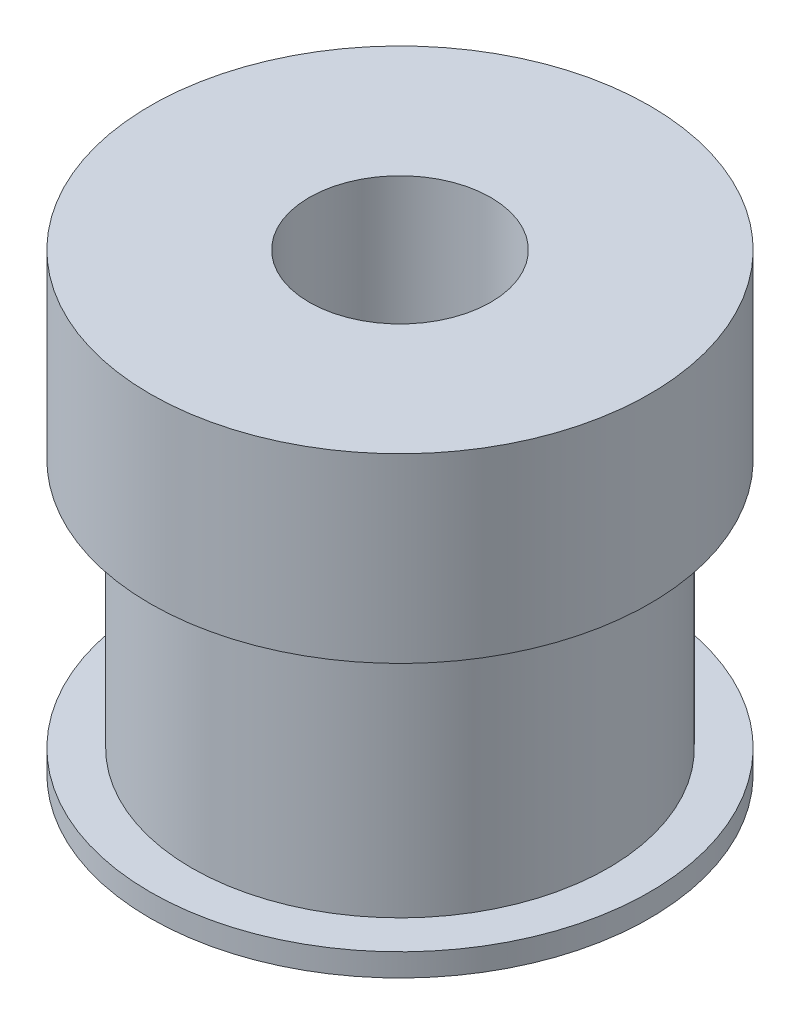
ISO-10303-21;
HEADER;
FILE_DESCRIPTION(('STEP AP214'),'2;1');
FILE_NAME('part.step','',(''),(''),'','','');
FILE_SCHEMA(('AUTOMOTIVE_DESIGN { 1 0 10303 214 1 1 1 1 }'));
ENDSEC;
DATA;
#1=APPLICATION_CONTEXT('core data for automotive mechanical design processes');
#2=APPLICATION_PROTOCOL_DEFINITION('international standard','automotive_design',2000,#1);
#3=PRODUCT_CONTEXT('',#1,'mechanical');
#4=PRODUCT('Part','Part','',(#3));
#5=PRODUCT_RELATED_PRODUCT_CATEGORY('part','',(#4));
#6=PRODUCT_DEFINITION_FORMATION('','',#4);
#7=PRODUCT_DEFINITION_CONTEXT('part definition',#1,'design');
#8=PRODUCT_DEFINITION('design','',#6,#7);
#9=PRODUCT_DEFINITION_SHAPE('','',#8);
#10=(LENGTH_UNIT() NAMED_UNIT(*) SI_UNIT(.MILLI.,.METRE.));
#11=(NAMED_UNIT(*) PLANE_ANGLE_UNIT() SI_UNIT($,.RADIAN.));
#12=(NAMED_UNIT(*) SI_UNIT($,.STERADIAN.) SOLID_ANGLE_UNIT());
#13=UNCERTAINTY_MEASURE_WITH_UNIT(LENGTH_MEASURE(1.E-05),#10,'distance_accuracy_value','');
#14=(GEOMETRIC_REPRESENTATION_CONTEXT(3) GLOBAL_UNCERTAINTY_ASSIGNED_CONTEXT((#13)) GLOBAL_UNIT_ASSIGNED_CONTEXT((#10,
#11,#12)) REPRESENTATION_CONTEXT('',''));
#15=CARTESIAN_POINT('',(0.,0.,0.));
#16=DIRECTION('',(0.,0.,1.));
#17=DIRECTION('',(1.,0.,0.));
#18=AXIS2_PLACEMENT_3D('',#15,#16,#17);
#19=CARTESIAN_POINT('',(0.,1.,0.));
#20=DIRECTION('',(0.,-1.,0.));
#21=DIRECTION('',(0.,0.,-1.));
#22=AXIS2_PLACEMENT_3D('',#19,#20,#21);
#23=CYLINDRICAL_SURFACE('',#22,11.);
#24=CARTESIAN_POINT('',(0.,1.,0.));
#25=DIRECTION('',(0.,1.,0.));
#26=DIRECTION('',(0.,0.,1.));
#27=AXIS2_PLACEMENT_3D('',#24,#25,#26);
#28=CIRCLE('',#27,11.);
#29=CARTESIAN_POINT('',(0.,1.,11.));
#30=VERTEX_POINT('',#29);
#31=EDGE_CURVE('E40',#30,#30,#28,.T.);
#32=ORIENTED_EDGE('',*,*,#31,.F.);
#33=EDGE_LOOP('',(#32));
#34=FACE_BOUND('',#33,.T.);
#35=CARTESIAN_POINT('',(0.,0.,0.));
#36=DIRECTION('',(0.,1.,0.));
#37=DIRECTION('',(0.,0.,1.));
#38=AXIS2_PLACEMENT_3D('',#35,#36,#37);
#39=CIRCLE('',#38,11.);
#40=CARTESIAN_POINT('',(0.,0.,11.));
#41=VERTEX_POINT('',#40);
#42=EDGE_CURVE('E36',#41,#41,#39,.T.);
#43=ORIENTED_EDGE('',*,*,#42,.T.);
#44=EDGE_LOOP('',(#43));
#45=FACE_BOUND('',#44,.T.);
#46=ADVANCED_FACE('F33',(#34,#45),#23,.T.);
#47=CARTESIAN_POINT('',(0.,1.,0.));
#48=DIRECTION('',(0.,1.,0.));
#49=DIRECTION('',(0.,0.,1.));
#50=AXIS2_PLACEMENT_3D('',#47,#48,#49);
#51=PLANE('',#50);
#52=CARTESIAN_POINT('',(0.,1.,0.));
#53=DIRECTION('',(0.,1.,0.));
#54=DIRECTION('',(0.,0.,1.));
#55=AXIS2_PLACEMENT_3D('',#52,#53,#54);
#56=CIRCLE('',#55,9.17);
#57=CARTESIAN_POINT('',(0.,1.,9.17));
#58=VERTEX_POINT('',#57);
#59=EDGE_CURVE('E10',#58,#58,#56,.T.);
#60=ORIENTED_EDGE('',*,*,#59,.F.);
#61=EDGE_LOOP('',(#60));
#62=FACE_BOUND('',#61,.T.);
#63=ORIENTED_EDGE('',*,*,#31,.T.);
#64=EDGE_LOOP('',(#63));
#65=FACE_BOUND('',#64,.T.);
#66=ADVANCED_FACE('F91',(#62,#65),#51,.T.);
#67=CARTESIAN_POINT('',(0.,0.,0.));
#68=DIRECTION('',(0.,1.,0.));
#69=DIRECTION('',(0.,0.,1.));
#70=AXIS2_PLACEMENT_3D('',#67,#68,#69);
#71=PLANE('',#70);
#72=CARTESIAN_POINT('',(0.,0.,0.));
#73=DIRECTION('',(0.,1.,0.));
#74=DIRECTION('',(0.,0.,1.));
#75=AXIS2_PLACEMENT_3D('',#72,#73,#74);
#76=CIRCLE('',#75,4.);
#77=CARTESIAN_POINT('',(0.,0.,4.));
#78=VERTEX_POINT('',#77);
#79=EDGE_CURVE('E53',#78,#78,#76,.T.);
#80=ORIENTED_EDGE('',*,*,#79,.T.);
#81=EDGE_LOOP('',(#80));
#82=FACE_BOUND('',#81,.T.);
#83=ORIENTED_EDGE('',*,*,#42,.F.);
#84=EDGE_LOOP('',(#83));
#85=FACE_BOUND('',#84,.T.);
#86=ADVANCED_FACE('F62',(#82,#85),#71,.F.);
#87=CARTESIAN_POINT('',(0.,12.,0.));
#88=DIRECTION('',(0.,-1.,0.));
#89=DIRECTION('',(0.,0.,-1.));
#90=AXIS2_PLACEMENT_3D('',#87,#88,#89);
#91=CYLINDRICAL_SURFACE('',#90,9.17);
#92=CARTESIAN_POINT('',(0.,12.,0.));
#93=DIRECTION('',(0.,1.,0.));
#94=DIRECTION('',(0.,0.,1.));
#95=AXIS2_PLACEMENT_3D('',#92,#93,#94);
#96=CIRCLE('',#95,9.17);
#97=CARTESIAN_POINT('',(0.,12.,9.17));
#98=VERTEX_POINT('',#97);
#99=EDGE_CURVE('E46',#98,#98,#96,.T.);
#100=ORIENTED_EDGE('',*,*,#99,.F.);
#101=EDGE_LOOP('',(#100));
#102=FACE_BOUND('',#101,.T.);
#103=ORIENTED_EDGE('',*,*,#59,.T.);
#104=EDGE_LOOP('',(#103));
#105=FACE_BOUND('',#104,.T.);
#106=ADVANCED_FACE('F81',(#102,#105),#91,.T.);
#107=CARTESIAN_POINT('',(0.,20.,0.));
#108=DIRECTION('',(0.,-1.,0.));
#109=DIRECTION('',(0.,0.,-1.));
#110=AXIS2_PLACEMENT_3D('',#107,#108,#109);
#111=CYLINDRICAL_SURFACE('',#110,11.);
#112=CARTESIAN_POINT('',(0.,20.,0.));
#113=DIRECTION('',(0.,1.,0.));
#114=DIRECTION('',(0.,0.,1.));
#115=AXIS2_PLACEMENT_3D('',#112,#113,#114);
#116=CIRCLE('',#115,11.);
#117=CARTESIAN_POINT('',(0.,20.,11.));
#118=VERTEX_POINT('',#117);
#119=EDGE_CURVE('E49',#118,#118,#116,.T.);
#120=ORIENTED_EDGE('',*,*,#119,.F.);
#121=EDGE_LOOP('',(#120));
#122=FACE_BOUND('',#121,.T.);
#123=CARTESIAN_POINT('',(0.,12.,0.));
#124=DIRECTION('',(0.,1.,0.));
#125=DIRECTION('',(0.,0.,1.));
#126=AXIS2_PLACEMENT_3D('',#123,#124,#125);
#127=CIRCLE('',#126,11.);
#128=CARTESIAN_POINT('',(0.,12.,11.));
#129=VERTEX_POINT('',#128);
#130=EDGE_CURVE('E50',#129,#129,#127,.T.);
#131=ORIENTED_EDGE('',*,*,#130,.T.);
#132=EDGE_LOOP('',(#131));
#133=FACE_BOUND('',#132,.T.);
#134=ADVANCED_FACE('F75',(#122,#133),#111,.T.);
#135=CARTESIAN_POINT('',(0.,20.,0.));
#136=DIRECTION('',(0.,1.,0.));
#137=DIRECTION('',(0.,0.,1.));
#138=AXIS2_PLACEMENT_3D('',#135,#136,#137);
#139=PLANE('',#138);
#140=CARTESIAN_POINT('',(0.,20.,0.));
#141=DIRECTION('',(0.,1.,0.));
#142=DIRECTION('',(0.,0.,1.));
#143=AXIS2_PLACEMENT_3D('',#140,#141,#142);
#144=CIRCLE('',#143,4.);
#145=CARTESIAN_POINT('',(0.,20.,4.));
#146=VERTEX_POINT('',#145);
#147=EDGE_CURVE('E56',#146,#146,#144,.T.);
#148=ORIENTED_EDGE('',*,*,#147,.F.);
#149=EDGE_LOOP('',(#148));
#150=FACE_BOUND('',#149,.T.);
#151=ORIENTED_EDGE('',*,*,#119,.T.);
#152=EDGE_LOOP('',(#151));
#153=FACE_BOUND('',#152,.T.);
#154=ADVANCED_FACE('F72',(#150,#153),#139,.T.);
#155=CARTESIAN_POINT('',(0.,12.,0.));
#156=DIRECTION('',(0.,1.,0.));
#157=DIRECTION('',(0.,0.,1.));
#158=AXIS2_PLACEMENT_3D('',#155,#156,#157);
#159=PLANE('',#158);
#160=ORIENTED_EDGE('',*,*,#99,.T.);
#161=EDGE_LOOP('',(#160));
#162=FACE_BOUND('',#161,.T.);
#163=ORIENTED_EDGE('',*,*,#130,.F.);
#164=EDGE_LOOP('',(#163));
#165=FACE_BOUND('',#164,.T.);
#166=ADVANCED_FACE('F68',(#162,#165),#159,.F.);
#167=CARTESIAN_POINT('',(0.,0.,0.));
#168=DIRECTION('',(0.,1.,0.));
#169=DIRECTION('',(0.,0.,1.));
#170=AXIS2_PLACEMENT_3D('',#167,#168,#169);
#171=CYLINDRICAL_SURFACE('',#170,4.);
#172=ORIENTED_EDGE('',*,*,#79,.F.);
#173=EDGE_LOOP('',(#172));
#174=FACE_BOUND('',#173,.T.);
#175=ORIENTED_EDGE('',*,*,#147,.T.);
#176=EDGE_LOOP('',(#175));
#177=FACE_BOUND('',#176,.T.);
#178=ADVANCED_FACE('F65',(#174,#177),#171,.F.);
#179=CLOSED_SHELL('',(#46,#66,#86,#106,#134,#154,#166,#178));
#180=MANIFOLD_SOLID_BREP('B2',#179);
#181=ADVANCED_BREP_SHAPE_REPRESENTATION('',(#18,#180),#14);
#182=SHAPE_DEFINITION_REPRESENTATION(#9,#181);
ENDSEC;
END-ISO-10303-21;
